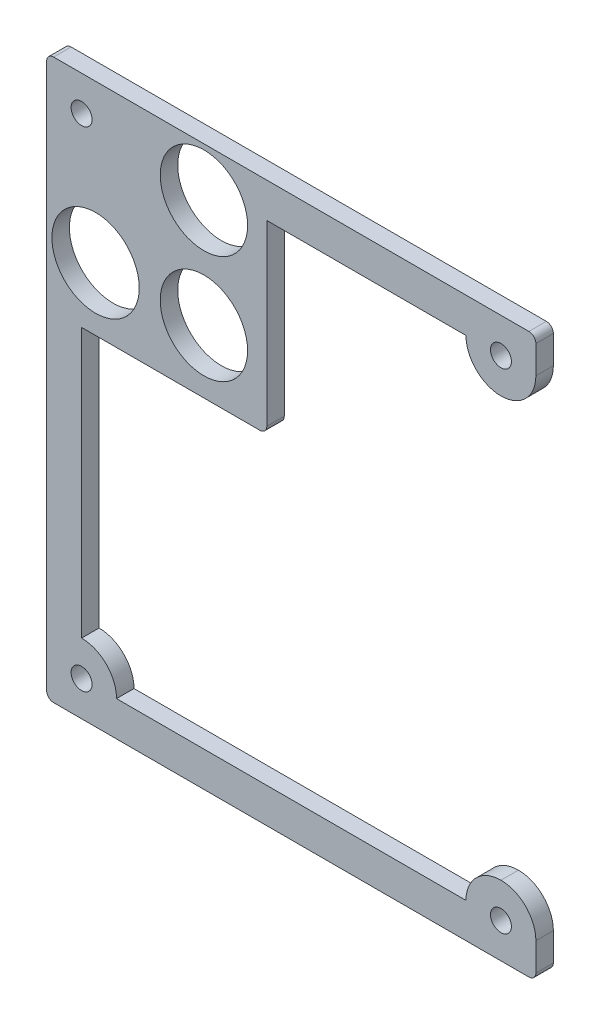
ISO-10303-21;
HEADER;
FILE_DESCRIPTION(('STEP AP214'),'2;1');
FILE_NAME('part.step','',(''),(''),'','','');
FILE_SCHEMA(('AUTOMOTIVE_DESIGN { 1 0 10303 214 1 1 1 1 }'));
ENDSEC;
DATA;
#1=APPLICATION_CONTEXT('core data for automotive mechanical design processes');
#2=APPLICATION_PROTOCOL_DEFINITION('international standard','automotive_design',2000,#1);
#3=PRODUCT_CONTEXT('',#1,'mechanical');
#4=PRODUCT('Part','Part','',(#3));
#5=PRODUCT_RELATED_PRODUCT_CATEGORY('part','',(#4));
#6=PRODUCT_DEFINITION_FORMATION('','',#4);
#7=PRODUCT_DEFINITION_CONTEXT('part definition',#1,'design');
#8=PRODUCT_DEFINITION('design','',#6,#7);
#9=PRODUCT_DEFINITION_SHAPE('','',#8);
#10=(LENGTH_UNIT() NAMED_UNIT(*) SI_UNIT(.MILLI.,.METRE.));
#11=(NAMED_UNIT(*) PLANE_ANGLE_UNIT() SI_UNIT($,.RADIAN.));
#12=(NAMED_UNIT(*) SI_UNIT($,.STERADIAN.) SOLID_ANGLE_UNIT());
#13=UNCERTAINTY_MEASURE_WITH_UNIT(LENGTH_MEASURE(1.E-05),#10,'distance_accuracy_value','');
#14=(GEOMETRIC_REPRESENTATION_CONTEXT(3) GLOBAL_UNCERTAINTY_ASSIGNED_CONTEXT((#13)) GLOBAL_UNIT_ASSIGNED_CONTEXT((#10,
#11,#12)) REPRESENTATION_CONTEXT('',''));
#15=CARTESIAN_POINT('',(0.,0.,0.));
#16=DIRECTION('',(0.,0.,1.));
#17=DIRECTION('',(1.,0.,0.));
#18=AXIS2_PLACEMENT_3D('',#15,#16,#17);
#19=CARTESIAN_POINT('',(130.,150.,5.));
#20=DIRECTION('',(0.,0.,1.));
#21=DIRECTION('',(1.,0.,0.));
#22=AXIS2_PLACEMENT_3D('',#19,#20,#21);
#23=PLANE('',#22);
#24=CARTESIAN_POINT('',(130.,150.,5.));
#25=DIRECTION('',(0.,0.,1.));
#26=DIRECTION('',(1.,0.,0.));
#27=AXIS2_PLACEMENT_3D('',#24,#25,#26);
#28=CIRCLE('',#27,3.);
#29=CARTESIAN_POINT('',(133.,150.,5.));
#30=VERTEX_POINT('',#29);
#31=EDGE_CURVE('E339',#30,#30,#28,.T.);
#32=ORIENTED_EDGE('',*,*,#31,.F.);
#33=EDGE_LOOP('',(#32));
#34=FACE_BOUND('',#33,.T.);
#35=CARTESIAN_POINT('',(10.,10.,5.));
#36=DIRECTION('',(0.,0.,1.));
#37=DIRECTION('',(1.,0.,0.));
#38=AXIS2_PLACEMENT_3D('',#35,#36,#37);
#39=CIRCLE('',#38,2.99999999999999);
#40=CARTESIAN_POINT('',(13.,10.,5.));
#41=VERTEX_POINT('',#40);
#42=EDGE_CURVE('E327',#41,#41,#39,.T.);
#43=ORIENTED_EDGE('',*,*,#42,.F.);
#44=EDGE_LOOP('',(#43));
#45=FACE_BOUND('',#44,.T.);
#46=CARTESIAN_POINT('',(45.,115.,5.));
#47=DIRECTION('',(0.,0.,1.));
#48=DIRECTION('',(1.,0.,0.));
#49=AXIS2_PLACEMENT_3D('',#46,#47,#48);
#50=CIRCLE('',#49,12.5);
#51=CARTESIAN_POINT('',(57.5,115.,5.));
#52=VERTEX_POINT('',#51);
#53=EDGE_CURVE('E315',#52,#52,#50,.T.);
#54=ORIENTED_EDGE('',*,*,#53,.F.);
#55=EDGE_LOOP('',(#54));
#56=FACE_BOUND('',#55,.T.);
#57=CARTESIAN_POINT('',(130.,150.,5.));
#58=DIRECTION('',(0.,0.,1.));
#59=DIRECTION('',(1.,0.,0.));
#60=AXIS2_PLACEMENT_3D('',#57,#58,#59);
#61=CIRCLE('',#60,9.99999999999999);
#62=CARTESIAN_POINT('',(120.,150.,5.));
#63=VERTEX_POINT('',#62);
#64=CARTESIAN_POINT('',(130.,140.,5.));
#65=VERTEX_POINT('',#64);
#66=EDGE_CURVE('E165',#63,#65,#61,.T.);
#67=ORIENTED_EDGE('',*,*,#66,.T.);
#68=CARTESIAN_POINT('',(130.,150.,5.));
#69=DIRECTION('',(0.,0.,1.));
#70=DIRECTION('',(1.,0.,0.));
#71=AXIS2_PLACEMENT_3D('',#68,#69,#70);
#72=CIRCLE('',#71,10.);
#73=CARTESIAN_POINT('',(140.,150.,5.));
#74=VERTEX_POINT('',#73);
#75=EDGE_CURVE('E11',#65,#74,#72,.T.);
#76=ORIENTED_EDGE('',*,*,#75,.T.);
#77=DIRECTION('',(0.,1.,0.));
#78=VECTOR('',#77,1.);
#79=CARTESIAN_POINT('',(140.,140.,5.));
#80=LINE('',#79,#78);
#81=CARTESIAN_POINT('',(140.,158.,5.));
#82=VERTEX_POINT('',#81);
#83=EDGE_CURVE('E173',#74,#82,#80,.T.);
#84=ORIENTED_EDGE('',*,*,#83,.T.);
#85=CARTESIAN_POINT('',(138.,158.,5.));
#86=DIRECTION('',(0.,0.,1.));
#87=DIRECTION('',(1.,0.,0.));
#88=AXIS2_PLACEMENT_3D('',#85,#86,#87);
#89=CIRCLE('',#88,1.99999999999997);
#90=CARTESIAN_POINT('',(138.,160.,5.));
#91=VERTEX_POINT('',#90);
#92=EDGE_CURVE('E309',#82,#91,#89,.T.);
#93=ORIENTED_EDGE('',*,*,#92,.T.);
#94=DIRECTION('',(-1.,0.,0.));
#95=VECTOR('',#94,1.);
#96=CARTESIAN_POINT('',(138.,160.,5.));
#97=LINE('',#96,#95);
#98=CARTESIAN_POINT('',(2.,160.,5.));
#99=VERTEX_POINT('',#98);
#100=EDGE_CURVE('E307',#91,#99,#97,.T.);
#101=ORIENTED_EDGE('',*,*,#100,.T.);
#102=CARTESIAN_POINT('',(2.,158.,5.));
#103=DIRECTION('',(0.,0.,1.));
#104=DIRECTION('',(1.,0.,0.));
#105=AXIS2_PLACEMENT_3D('',#102,#103,#104);
#106=CIRCLE('',#105,2.);
#107=CARTESIAN_POINT('',(0.,158.,5.));
#108=VERTEX_POINT('',#107);
#109=EDGE_CURVE('E305',#99,#108,#106,.T.);
#110=ORIENTED_EDGE('',*,*,#109,.T.);
#111=DIRECTION('',(0.,-1.,0.));
#112=VECTOR('',#111,1.);
#113=CARTESIAN_POINT('',(0.,158.,5.));
#114=LINE('',#113,#112);
#115=CARTESIAN_POINT('',(0.,2.,5.));
#116=VERTEX_POINT('',#115);
#117=EDGE_CURVE('E303',#108,#116,#114,.T.);
#118=ORIENTED_EDGE('',*,*,#117,.T.);
#119=CARTESIAN_POINT('',(2.00000000000001,2.00000000000001,5.));
#120=DIRECTION('',(0.,0.,1.));
#121=DIRECTION('',(1.,0.,0.));
#122=AXIS2_PLACEMENT_3D('',#119,#120,#121);
#123=CIRCLE('',#122,2.00000000000001);
#124=CARTESIAN_POINT('',(2.,0.,5.));
#125=VERTEX_POINT('',#124);
#126=EDGE_CURVE('E301',#116,#125,#123,.T.);
#127=ORIENTED_EDGE('',*,*,#126,.T.);
#128=DIRECTION('',(1.,0.,0.));
#129=VECTOR('',#128,1.);
#130=CARTESIAN_POINT('',(2.,0.,5.));
#131=LINE('',#130,#129);
#132=CARTESIAN_POINT('',(138.,0.,5.));
#133=VERTEX_POINT('',#132);
#134=EDGE_CURVE('E299',#125,#133,#131,.T.);
#135=ORIENTED_EDGE('',*,*,#134,.T.);
#136=CARTESIAN_POINT('',(138.,2.,5.));
#137=DIRECTION('',(0.,0.,1.));
#138=DIRECTION('',(1.,0.,0.));
#139=AXIS2_PLACEMENT_3D('',#136,#137,#138);
#140=CIRCLE('',#139,2.);
#141=CARTESIAN_POINT('',(140.,2.,5.));
#142=VERTEX_POINT('',#141);
#143=EDGE_CURVE('E297',#133,#142,#140,.T.);
#144=ORIENTED_EDGE('',*,*,#143,.T.);
#145=DIRECTION('',(0.,1.,0.));
#146=VECTOR('',#145,1.);
#147=CARTESIAN_POINT('',(140.,20.,5.));
#148=LINE('',#147,#146);
#149=CARTESIAN_POINT('',(140.,10.,5.));
#150=VERTEX_POINT('',#149);
#151=EDGE_CURVE('E294',#142,#150,#148,.T.);
#152=ORIENTED_EDGE('',*,*,#151,.T.);
#153=CARTESIAN_POINT('',(130.,10.,5.));
#154=DIRECTION('',(0.,0.,1.));
#155=DIRECTION('',(1.,0.,0.));
#156=AXIS2_PLACEMENT_3D('',#153,#154,#155);
#157=CIRCLE('',#156,10.);
#158=CARTESIAN_POINT('',(130.,20.,5.));
#159=VERTEX_POINT('',#158);
#160=EDGE_CURVE('E187',#150,#159,#157,.T.);
#161=ORIENTED_EDGE('',*,*,#160,.T.);
#162=CARTESIAN_POINT('',(130.,10.,5.));
#163=DIRECTION('',(0.,0.,1.));
#164=DIRECTION('',(1.,0.,0.));
#165=AXIS2_PLACEMENT_3D('',#162,#163,#164);
#166=CIRCLE('',#165,10.);
#167=CARTESIAN_POINT('',(120.,10.,5.));
#168=VERTEX_POINT('',#167);
#169=EDGE_CURVE('E292',#159,#168,#166,.T.);
#170=ORIENTED_EDGE('',*,*,#169,.T.);
#171=DIRECTION('',(-1.,0.,0.));
#172=VECTOR('',#171,1.);
#173=CARTESIAN_POINT('',(20.,10.,5.));
#174=LINE('',#173,#172);
#175=CARTESIAN_POINT('',(20.,10.,5.));
#176=VERTEX_POINT('',#175);
#177=EDGE_CURVE('E290',#168,#176,#174,.T.);
#178=ORIENTED_EDGE('',*,*,#177,.T.);
#179=CARTESIAN_POINT('',(10.,10.,5.));
#180=DIRECTION('',(0.,0.,1.));
#181=DIRECTION('',(1.,0.,0.));
#182=AXIS2_PLACEMENT_3D('',#179,#180,#181);
#183=CIRCLE('',#182,10.);
#184=CARTESIAN_POINT('',(10.,20.,5.));
#185=VERTEX_POINT('',#184);
#186=EDGE_CURVE('E288',#176,#185,#183,.T.);
#187=ORIENTED_EDGE('',*,*,#186,.T.);
#188=DIRECTION('',(0.,1.,0.));
#189=VECTOR('',#188,1.);
#190=CARTESIAN_POINT('',(10.,97.,5.));
#191=LINE('',#190,#189);
#192=CARTESIAN_POINT('',(10.,97.,5.));
#193=VERTEX_POINT('',#192);
#194=EDGE_CURVE('E286',#185,#193,#191,.T.);
#195=ORIENTED_EDGE('',*,*,#194,.T.);
#196=DIRECTION('',(1.,0.,0.));
#197=VECTOR('',#196,1.);
#198=CARTESIAN_POINT('',(61.,97.,5.));
#199=LINE('',#198,#197);
#200=CARTESIAN_POINT('',(61.,97.,5.));
#201=VERTEX_POINT('',#200);
#202=EDGE_CURVE('E284',#193,#201,#199,.T.);
#203=ORIENTED_EDGE('',*,*,#202,.T.);
#204=CARTESIAN_POINT('',(61.,99.,5.));
#205=DIRECTION('',(0.,0.,1.));
#206=DIRECTION('',(1.,0.,0.));
#207=AXIS2_PLACEMENT_3D('',#204,#205,#206);
#208=CIRCLE('',#207,2.00000000000003);
#209=CARTESIAN_POINT('',(63.,99.,5.));
#210=VERTEX_POINT('',#209);
#211=EDGE_CURVE('E282',#201,#210,#208,.T.);
#212=ORIENTED_EDGE('',*,*,#211,.T.);
#213=DIRECTION('',(0.,1.,0.));
#214=VECTOR('',#213,1.);
#215=CARTESIAN_POINT('',(63.,150.,5.));
#216=LINE('',#215,#214);
#217=CARTESIAN_POINT('',(63.,150.,5.));
#218=VERTEX_POINT('',#217);
#219=EDGE_CURVE('E280',#210,#218,#216,.T.);
#220=ORIENTED_EDGE('',*,*,#219,.T.);
#221=DIRECTION('',(1.,0.,0.));
#222=VECTOR('',#221,1.);
#223=CARTESIAN_POINT('',(120.,150.,5.));
#224=LINE('',#223,#222);
#225=EDGE_CURVE('E169',#218,#63,#224,.T.);
#226=ORIENTED_EDGE('',*,*,#225,.T.);
#227=EDGE_LOOP('',(#67,#76,#84,#93,#101,#110,#118,#127,#135,#144,#152,#161,#170,#178,#187,#195,
#203,#212,#220,#226));
#228=FACE_BOUND('',#227,.T.);
#229=CARTESIAN_POINT('',(14.,115.,5.));
#230=DIRECTION('',(0.,0.,1.));
#231=DIRECTION('',(1.,0.,0.));
#232=AXIS2_PLACEMENT_3D('',#229,#230,#231);
#233=CIRCLE('',#232,12.5);
#234=CARTESIAN_POINT('',(26.5,115.,5.));
#235=VERTEX_POINT('',#234);
#236=EDGE_CURVE('E278',#235,#235,#233,.T.);
#237=ORIENTED_EDGE('',*,*,#236,.F.);
#238=EDGE_LOOP('',(#237));
#239=FACE_BOUND('',#238,.T.);
#240=CARTESIAN_POINT('',(45.,146.,5.));
#241=DIRECTION('',(0.,0.,1.));
#242=DIRECTION('',(1.,0.,0.));
#243=AXIS2_PLACEMENT_3D('',#240,#241,#242);
#244=CIRCLE('',#243,12.5);
#245=CARTESIAN_POINT('',(57.5,146.,5.));
#246=VERTEX_POINT('',#245);
#247=EDGE_CURVE('E321',#246,#246,#244,.T.);
#248=ORIENTED_EDGE('',*,*,#247,.F.);
#249=EDGE_LOOP('',(#248));
#250=FACE_BOUND('',#249,.T.);
#251=CARTESIAN_POINT('',(130.,10.,5.));
#252=DIRECTION('',(0.,0.,1.));
#253=DIRECTION('',(1.,0.,0.));
#254=AXIS2_PLACEMENT_3D('',#251,#252,#253);
#255=CIRCLE('',#254,3.00000000000003);
#256=CARTESIAN_POINT('',(133.,10.,5.));
#257=VERTEX_POINT('',#256);
#258=EDGE_CURVE('E333',#257,#257,#255,.T.);
#259=ORIENTED_EDGE('',*,*,#258,.F.);
#260=EDGE_LOOP('',(#259));
#261=FACE_BOUND('',#260,.T.);
#262=CARTESIAN_POINT('',(10.,150.,5.));
#263=DIRECTION('',(0.,0.,1.));
#264=DIRECTION('',(1.,0.,0.));
#265=AXIS2_PLACEMENT_3D('',#262,#263,#264);
#266=CIRCLE('',#265,2.99999999999997);
#267=CARTESIAN_POINT('',(13.,150.,5.));
#268=VERTEX_POINT('',#267);
#269=EDGE_CURVE('E345',#268,#268,#266,.T.);
#270=ORIENTED_EDGE('',*,*,#269,.F.);
#271=EDGE_LOOP('',(#270));
#272=FACE_BOUND('',#271,.T.);
#273=ADVANCED_FACE('F32',(#34,#45,#56,#228,#239,#250,#261,#272),#23,.T.);
#274=CARTESIAN_POINT('',(130.,150.,0.));
#275=DIRECTION('',(0.,0.,1.));
#276=DIRECTION('',(1.,0.,0.));
#277=AXIS2_PLACEMENT_3D('',#274,#275,#276);
#278=PLANE('',#277);
#279=DIRECTION('',(0.,1.,0.));
#280=VECTOR('',#279,1.);
#281=CARTESIAN_POINT('',(140.,140.,0.));
#282=LINE('',#281,#280);
#283=CARTESIAN_POINT('',(140.,150.,0.));
#284=VERTEX_POINT('',#283);
#285=CARTESIAN_POINT('',(140.,158.,0.));
#286=VERTEX_POINT('',#285);
#287=EDGE_CURVE('E275',#284,#286,#282,.T.);
#288=ORIENTED_EDGE('',*,*,#287,.F.);
#289=CARTESIAN_POINT('',(130.,150.,0.));
#290=DIRECTION('',(0.,0.,1.));
#291=DIRECTION('',(1.,0.,0.));
#292=AXIS2_PLACEMENT_3D('',#289,#290,#291);
#293=CIRCLE('',#292,10.);
#294=CARTESIAN_POINT('',(130.,140.,0.));
#295=VERTEX_POINT('',#294);
#296=EDGE_CURVE('E40',#284,#295,#293,.F.);
#297=ORIENTED_EDGE('',*,*,#296,.T.);
#298=CARTESIAN_POINT('',(130.,150.,0.));
#299=DIRECTION('',(0.,0.,1.));
#300=DIRECTION('',(1.,0.,0.));
#301=AXIS2_PLACEMENT_3D('',#298,#299,#300);
#302=CIRCLE('',#301,9.99999999999999);
#303=CARTESIAN_POINT('',(120.,150.,0.));
#304=VERTEX_POINT('',#303);
#305=EDGE_CURVE('E180',#304,#295,#302,.T.);
#306=ORIENTED_EDGE('',*,*,#305,.F.);
#307=DIRECTION('',(1.,0.,0.));
#308=VECTOR('',#307,1.);
#309=CARTESIAN_POINT('',(120.,150.,0.));
#310=LINE('',#309,#308);
#311=CARTESIAN_POINT('',(63.,150.,0.));
#312=VERTEX_POINT('',#311);
#313=EDGE_CURVE('E174',#312,#304,#310,.T.);
#314=ORIENTED_EDGE('',*,*,#313,.F.);
#315=DIRECTION('',(0.,1.,0.));
#316=VECTOR('',#315,1.);
#317=CARTESIAN_POINT('',(63.,150.,0.));
#318=LINE('',#317,#316);
#319=CARTESIAN_POINT('',(63.,99.,0.));
#320=VERTEX_POINT('',#319);
#321=EDGE_CURVE('E244',#320,#312,#318,.T.);
#322=ORIENTED_EDGE('',*,*,#321,.F.);
#323=CARTESIAN_POINT('',(61.,99.,0.));
#324=DIRECTION('',(0.,0.,1.));
#325=DIRECTION('',(1.,0.,0.));
#326=AXIS2_PLACEMENT_3D('',#323,#324,#325);
#327=CIRCLE('',#326,2.00000000000003);
#328=CARTESIAN_POINT('',(61.,97.,0.));
#329=VERTEX_POINT('',#328);
#330=EDGE_CURVE('E246',#329,#320,#327,.T.);
#331=ORIENTED_EDGE('',*,*,#330,.F.);
#332=DIRECTION('',(1.,0.,0.));
#333=VECTOR('',#332,1.);
#334=CARTESIAN_POINT('',(61.,97.,0.));
#335=LINE('',#334,#333);
#336=CARTESIAN_POINT('',(10.,97.,0.));
#337=VERTEX_POINT('',#336);
#338=EDGE_CURVE('E248',#337,#329,#335,.T.);
#339=ORIENTED_EDGE('',*,*,#338,.F.);
#340=DIRECTION('',(0.,1.,0.));
#341=VECTOR('',#340,1.);
#342=CARTESIAN_POINT('',(10.,97.,0.));
#343=LINE('',#342,#341);
#344=CARTESIAN_POINT('',(10.,20.,0.));
#345=VERTEX_POINT('',#344);
#346=EDGE_CURVE('E250',#345,#337,#343,.T.);
#347=ORIENTED_EDGE('',*,*,#346,.F.);
#348=CARTESIAN_POINT('',(10.,10.,0.));
#349=DIRECTION('',(0.,0.,1.));
#350=DIRECTION('',(1.,0.,0.));
#351=AXIS2_PLACEMENT_3D('',#348,#349,#350);
#352=CIRCLE('',#351,10.);
#353=CARTESIAN_POINT('',(20.,10.,0.));
#354=VERTEX_POINT('',#353);
#355=EDGE_CURVE('E252',#354,#345,#352,.T.);
#356=ORIENTED_EDGE('',*,*,#355,.F.);
#357=DIRECTION('',(-1.,0.,0.));
#358=VECTOR('',#357,1.);
#359=CARTESIAN_POINT('',(20.,10.,0.));
#360=LINE('',#359,#358);
#361=CARTESIAN_POINT('',(120.,10.,0.));
#362=VERTEX_POINT('',#361);
#363=EDGE_CURVE('E254',#362,#354,#360,.T.);
#364=ORIENTED_EDGE('',*,*,#363,.F.);
#365=CARTESIAN_POINT('',(130.,10.,0.));
#366=DIRECTION('',(0.,0.,1.));
#367=DIRECTION('',(1.,0.,0.));
#368=AXIS2_PLACEMENT_3D('',#365,#366,#367);
#369=CIRCLE('',#368,10.);
#370=CARTESIAN_POINT('',(130.,20.,0.));
#371=VERTEX_POINT('',#370);
#372=EDGE_CURVE('E256',#371,#362,#369,.T.);
#373=ORIENTED_EDGE('',*,*,#372,.F.);
#374=CARTESIAN_POINT('',(130.,10.,0.));
#375=DIRECTION('',(0.,0.,1.));
#376=DIRECTION('',(1.,0.,0.));
#377=AXIS2_PLACEMENT_3D('',#374,#375,#376);
#378=CIRCLE('',#377,10.);
#379=CARTESIAN_POINT('',(140.,10.,0.));
#380=VERTEX_POINT('',#379);
#381=EDGE_CURVE('E181',#371,#380,#378,.F.);
#382=ORIENTED_EDGE('',*,*,#381,.T.);
#383=DIRECTION('',(0.,1.,0.));
#384=VECTOR('',#383,1.);
#385=CARTESIAN_POINT('',(140.,20.,0.));
#386=LINE('',#385,#384);
#387=CARTESIAN_POINT('',(140.,2.,0.));
#388=VERTEX_POINT('',#387);
#389=EDGE_CURVE('E258',#388,#380,#386,.T.);
#390=ORIENTED_EDGE('',*,*,#389,.F.);
#391=CARTESIAN_POINT('',(138.,2.,0.));
#392=DIRECTION('',(0.,0.,1.));
#393=DIRECTION('',(1.,0.,0.));
#394=AXIS2_PLACEMENT_3D('',#391,#392,#393);
#395=CIRCLE('',#394,2.);
#396=CARTESIAN_POINT('',(138.,0.,0.));
#397=VERTEX_POINT('',#396);
#398=EDGE_CURVE('E261',#397,#388,#395,.T.);
#399=ORIENTED_EDGE('',*,*,#398,.F.);
#400=DIRECTION('',(1.,0.,0.));
#401=VECTOR('',#400,1.);
#402=CARTESIAN_POINT('',(2.,0.,0.));
#403=LINE('',#402,#401);
#404=CARTESIAN_POINT('',(2.,0.,0.));
#405=VERTEX_POINT('',#404);
#406=EDGE_CURVE('E263',#405,#397,#403,.T.);
#407=ORIENTED_EDGE('',*,*,#406,.F.);
#408=CARTESIAN_POINT('',(2.00000000000001,2.00000000000001,0.));
#409=DIRECTION('',(0.,0.,1.));
#410=DIRECTION('',(1.,0.,0.));
#411=AXIS2_PLACEMENT_3D('',#408,#409,#410);
#412=CIRCLE('',#411,2.00000000000001);
#413=CARTESIAN_POINT('',(0.,2.,0.));
#414=VERTEX_POINT('',#413);
#415=EDGE_CURVE('E265',#414,#405,#412,.T.);
#416=ORIENTED_EDGE('',*,*,#415,.F.);
#417=DIRECTION('',(0.,-1.,0.));
#418=VECTOR('',#417,1.);
#419=CARTESIAN_POINT('',(0.,158.,0.));
#420=LINE('',#419,#418);
#421=CARTESIAN_POINT('',(0.,158.,0.));
#422=VERTEX_POINT('',#421);
#423=EDGE_CURVE('E267',#422,#414,#420,.T.);
#424=ORIENTED_EDGE('',*,*,#423,.F.);
#425=CARTESIAN_POINT('',(2.,158.,0.));
#426=DIRECTION('',(0.,0.,1.));
#427=DIRECTION('',(1.,0.,0.));
#428=AXIS2_PLACEMENT_3D('',#425,#426,#427);
#429=CIRCLE('',#428,2.);
#430=CARTESIAN_POINT('',(2.,160.,0.));
#431=VERTEX_POINT('',#430);
#432=EDGE_CURVE('E269',#431,#422,#429,.T.);
#433=ORIENTED_EDGE('',*,*,#432,.F.);
#434=DIRECTION('',(-1.,0.,0.));
#435=VECTOR('',#434,1.);
#436=CARTESIAN_POINT('',(138.,160.,0.));
#437=LINE('',#436,#435);
#438=CARTESIAN_POINT('',(138.,160.,0.));
#439=VERTEX_POINT('',#438);
#440=EDGE_CURVE('E271',#439,#431,#437,.T.);
#441=ORIENTED_EDGE('',*,*,#440,.F.);
#442=CARTESIAN_POINT('',(138.,158.,0.));
#443=DIRECTION('',(0.,0.,1.));
#444=DIRECTION('',(1.,0.,0.));
#445=AXIS2_PLACEMENT_3D('',#442,#443,#444);
#446=CIRCLE('',#445,1.99999999999997);
#447=EDGE_CURVE('E273',#286,#439,#446,.T.);
#448=ORIENTED_EDGE('',*,*,#447,.F.);
#449=EDGE_LOOP('',(#288,#297,#306,#314,#322,#331,#339,#347,#356,#364,#373,#382,#390,#399,#407,
#416,#424,#433,#441,#448));
#450=FACE_BOUND('',#449,.T.);
#451=CARTESIAN_POINT('',(14.,115.,0.));
#452=DIRECTION('',(0.,0.,1.));
#453=DIRECTION('',(1.,0.,0.));
#454=AXIS2_PLACEMENT_3D('',#451,#452,#453);
#455=CIRCLE('',#454,12.5);
#456=CARTESIAN_POINT('',(26.5,115.,0.));
#457=VERTEX_POINT('',#456);
#458=EDGE_CURVE('E312',#457,#457,#455,.T.);
#459=ORIENTED_EDGE('',*,*,#458,.T.);
#460=EDGE_LOOP('',(#459));
#461=FACE_BOUND('',#460,.T.);
#462=CARTESIAN_POINT('',(45.,115.,0.));
#463=DIRECTION('',(0.,0.,1.));
#464=DIRECTION('',(1.,0.,0.));
#465=AXIS2_PLACEMENT_3D('',#462,#463,#464);
#466=CIRCLE('',#465,12.5);
#467=CARTESIAN_POINT('',(57.5,115.,0.));
#468=VERTEX_POINT('',#467);
#469=EDGE_CURVE('E318',#468,#468,#466,.T.);
#470=ORIENTED_EDGE('',*,*,#469,.T.);
#471=EDGE_LOOP('',(#470));
#472=FACE_BOUND('',#471,.T.);
#473=CARTESIAN_POINT('',(45.,146.,0.));
#474=DIRECTION('',(0.,0.,1.));
#475=DIRECTION('',(1.,0.,0.));
#476=AXIS2_PLACEMENT_3D('',#473,#474,#475);
#477=CIRCLE('',#476,12.5);
#478=CARTESIAN_POINT('',(57.5,146.,0.));
#479=VERTEX_POINT('',#478);
#480=EDGE_CURVE('E324',#479,#479,#477,.T.);
#481=ORIENTED_EDGE('',*,*,#480,.T.);
#482=EDGE_LOOP('',(#481));
#483=FACE_BOUND('',#482,.T.);
#484=CARTESIAN_POINT('',(10.,10.,0.));
#485=DIRECTION('',(0.,0.,1.));
#486=DIRECTION('',(1.,0.,0.));
#487=AXIS2_PLACEMENT_3D('',#484,#485,#486);
#488=CIRCLE('',#487,2.99999999999999);
#489=CARTESIAN_POINT('',(13.,10.,0.));
#490=VERTEX_POINT('',#489);
#491=EDGE_CURVE('E330',#490,#490,#488,.T.);
#492=ORIENTED_EDGE('',*,*,#491,.T.);
#493=EDGE_LOOP('',(#492));
#494=FACE_BOUND('',#493,.T.);
#495=CARTESIAN_POINT('',(130.,10.,0.));
#496=DIRECTION('',(0.,0.,1.));
#497=DIRECTION('',(1.,0.,0.));
#498=AXIS2_PLACEMENT_3D('',#495,#496,#497);
#499=CIRCLE('',#498,3.00000000000003);
#500=CARTESIAN_POINT('',(133.,10.,0.));
#501=VERTEX_POINT('',#500);
#502=EDGE_CURVE('E336',#501,#501,#499,.T.);
#503=ORIENTED_EDGE('',*,*,#502,.T.);
#504=EDGE_LOOP('',(#503));
#505=FACE_BOUND('',#504,.T.);
#506=CARTESIAN_POINT('',(130.,150.,0.));
#507=DIRECTION('',(0.,0.,1.));
#508=DIRECTION('',(1.,0.,0.));
#509=AXIS2_PLACEMENT_3D('',#506,#507,#508);
#510=CIRCLE('',#509,3.);
#511=CARTESIAN_POINT('',(133.,150.,0.));
#512=VERTEX_POINT('',#511);
#513=EDGE_CURVE('E342',#512,#512,#510,.T.);
#514=ORIENTED_EDGE('',*,*,#513,.T.);
#515=EDGE_LOOP('',(#514));
#516=FACE_BOUND('',#515,.T.);
#517=CARTESIAN_POINT('',(10.,150.,0.));
#518=DIRECTION('',(0.,0.,1.));
#519=DIRECTION('',(1.,0.,0.));
#520=AXIS2_PLACEMENT_3D('',#517,#518,#519);
#521=CIRCLE('',#520,2.99999999999997);
#522=CARTESIAN_POINT('',(13.,150.,0.));
#523=VERTEX_POINT('',#522);
#524=EDGE_CURVE('E348',#523,#523,#521,.T.);
#525=ORIENTED_EDGE('',*,*,#524,.T.);
#526=EDGE_LOOP('',(#525));
#527=FACE_BOUND('',#526,.T.);
#528=ADVANCED_FACE('F358',(#450,#461,#472,#483,#494,#505,#516,#527),#278,.F.);
#529=CARTESIAN_POINT('',(130.,150.,5.));
#530=DIRECTION('',(0.,0.,-1.));
#531=DIRECTION('',(-1.,0.,0.));
#532=AXIS2_PLACEMENT_3D('',#529,#530,#531);
#533=CYLINDRICAL_SURFACE('',#532,9.99999999999999);
#534=ORIENTED_EDGE('',*,*,#305,.T.);
#535=DIRECTION('',(0.,0.,-1.));
#536=VECTOR('',#535,1.);
#537=CARTESIAN_POINT('',(130.,140.,5.));
#538=LINE('',#537,#536);
#539=EDGE_CURVE('E177',#65,#295,#538,.T.);
#540=ORIENTED_EDGE('',*,*,#539,.F.);
#541=ORIENTED_EDGE('',*,*,#66,.F.);
#542=DIRECTION('',(0.,0.,-1.));
#543=VECTOR('',#542,1.);
#544=CARTESIAN_POINT('',(120.,150.,5.));
#545=LINE('',#544,#543);
#546=EDGE_CURVE('E241',#63,#304,#545,.T.);
#547=ORIENTED_EDGE('',*,*,#546,.T.);
#548=EDGE_LOOP('',(#534,#540,#541,#547));
#549=FACE_BOUND('',#548,.T.);
#550=ADVANCED_FACE('F178',(#549),#533,.T.);
#551=CARTESIAN_POINT('',(140.,140.,5.));
#552=DIRECTION('',(-1.,0.,0.));
#553=DIRECTION('',(0.,0.,1.));
#554=AXIS2_PLACEMENT_3D('',#551,#552,#553);
#555=PLANE('',#554);
#556=ORIENTED_EDGE('',*,*,#83,.F.);
#557=DIRECTION('',(0.,0.,-1.));
#558=VECTOR('',#557,1.);
#559=CARTESIAN_POINT('',(140.,150.,5.));
#560=LINE('',#559,#558);
#561=EDGE_CURVE('E184',#74,#284,#560,.T.);
#562=ORIENTED_EDGE('',*,*,#561,.T.);
#563=ORIENTED_EDGE('',*,*,#287,.T.);
#564=DIRECTION('',(0.,0.,-1.));
#565=VECTOR('',#564,1.);
#566=CARTESIAN_POINT('',(140.,158.,5.));
#567=LINE('',#566,#565);
#568=EDGE_CURVE('E182',#82,#286,#567,.T.);
#569=ORIENTED_EDGE('',*,*,#568,.F.);
#570=EDGE_LOOP('',(#556,#562,#563,#569));
#571=FACE_BOUND('',#570,.T.);
#572=ADVANCED_FACE('F435',(#571),#555,.F.);
#573=CARTESIAN_POINT('',(138.,158.,5.));
#574=DIRECTION('',(0.,0.,-1.));
#575=DIRECTION('',(-1.,0.,0.));
#576=AXIS2_PLACEMENT_3D('',#573,#574,#575);
#577=CYLINDRICAL_SURFACE('',#576,1.99999999999997);
#578=ORIENTED_EDGE('',*,*,#447,.T.);
#579=DIRECTION('',(0.,0.,-1.));
#580=VECTOR('',#579,1.);
#581=CARTESIAN_POINT('',(138.,160.,5.));
#582=LINE('',#581,#580);
#583=EDGE_CURVE('E196',#91,#439,#582,.T.);
#584=ORIENTED_EDGE('',*,*,#583,.F.);
#585=ORIENTED_EDGE('',*,*,#92,.F.);
#586=ORIENTED_EDGE('',*,*,#568,.T.);
#587=EDGE_LOOP('',(#578,#584,#585,#586));
#588=FACE_BOUND('',#587,.T.);
#589=ADVANCED_FACE('F431',(#588),#577,.T.);
#590=CARTESIAN_POINT('',(138.,160.,5.));
#591=DIRECTION('',(0.,-1.,0.));
#592=DIRECTION('',(0.,0.,-1.));
#593=AXIS2_PLACEMENT_3D('',#590,#591,#592);
#594=PLANE('',#593);
#595=ORIENTED_EDGE('',*,*,#440,.T.);
#596=DIRECTION('',(0.,0.,-1.));
#597=VECTOR('',#596,1.);
#598=CARTESIAN_POINT('',(2.,160.,5.));
#599=LINE('',#598,#597);
#600=EDGE_CURVE('E199',#99,#431,#599,.T.);
#601=ORIENTED_EDGE('',*,*,#600,.F.);
#602=ORIENTED_EDGE('',*,*,#100,.F.);
#603=ORIENTED_EDGE('',*,*,#583,.T.);
#604=EDGE_LOOP('',(#595,#601,#602,#603));
#605=FACE_BOUND('',#604,.T.);
#606=ADVANCED_FACE('F427',(#605),#594,.F.);
#607=CARTESIAN_POINT('',(2.,158.,5.));
#608=DIRECTION('',(0.,0.,-1.));
#609=DIRECTION('',(-1.,0.,0.));
#610=AXIS2_PLACEMENT_3D('',#607,#608,#609);
#611=CYLINDRICAL_SURFACE('',#610,2.);
#612=ORIENTED_EDGE('',*,*,#432,.T.);
#613=DIRECTION('',(0.,0.,-1.));
#614=VECTOR('',#613,1.);
#615=CARTESIAN_POINT('',(0.,158.,5.));
#616=LINE('',#615,#614);
#617=EDGE_CURVE('E202',#108,#422,#616,.T.);
#618=ORIENTED_EDGE('',*,*,#617,.F.);
#619=ORIENTED_EDGE('',*,*,#109,.F.);
#620=ORIENTED_EDGE('',*,*,#600,.T.);
#621=EDGE_LOOP('',(#612,#618,#619,#620));
#622=FACE_BOUND('',#621,.T.);
#623=ADVANCED_FACE('F423',(#622),#611,.T.);
#624=CARTESIAN_POINT('',(0.,158.,5.));
#625=DIRECTION('',(1.,0.,0.));
#626=DIRECTION('',(0.,0.,-1.));
#627=AXIS2_PLACEMENT_3D('',#624,#625,#626);
#628=PLANE('',#627);
#629=ORIENTED_EDGE('',*,*,#423,.T.);
#630=DIRECTION('',(0.,0.,-1.));
#631=VECTOR('',#630,1.);
#632=CARTESIAN_POINT('',(0.,2.,5.));
#633=LINE('',#632,#631);
#634=EDGE_CURVE('E205',#116,#414,#633,.T.);
#635=ORIENTED_EDGE('',*,*,#634,.F.);
#636=ORIENTED_EDGE('',*,*,#117,.F.);
#637=ORIENTED_EDGE('',*,*,#617,.T.);
#638=EDGE_LOOP('',(#629,#635,#636,#637));
#639=FACE_BOUND('',#638,.T.);
#640=ADVANCED_FACE('F419',(#639),#628,.F.);
#641=CARTESIAN_POINT('',(2.00000000000001,2.00000000000001,5.));
#642=DIRECTION('',(0.,0.,-1.));
#643=DIRECTION('',(-1.,0.,0.));
#644=AXIS2_PLACEMENT_3D('',#641,#642,#643);
#645=CYLINDRICAL_SURFACE('',#644,2.00000000000001);
#646=ORIENTED_EDGE('',*,*,#415,.T.);
#647=DIRECTION('',(0.,0.,-1.));
#648=VECTOR('',#647,1.);
#649=CARTESIAN_POINT('',(2.,0.,5.));
#650=LINE('',#649,#648);
#651=EDGE_CURVE('E208',#125,#405,#650,.T.);
#652=ORIENTED_EDGE('',*,*,#651,.F.);
#653=ORIENTED_EDGE('',*,*,#126,.F.);
#654=ORIENTED_EDGE('',*,*,#634,.T.);
#655=EDGE_LOOP('',(#646,#652,#653,#654));
#656=FACE_BOUND('',#655,.T.);
#657=ADVANCED_FACE('F415',(#656),#645,.T.);
#658=CARTESIAN_POINT('',(2.,0.,5.));
#659=DIRECTION('',(0.,1.,0.));
#660=DIRECTION('',(0.,0.,1.));
#661=AXIS2_PLACEMENT_3D('',#658,#659,#660);
#662=PLANE('',#661);
#663=ORIENTED_EDGE('',*,*,#406,.T.);
#664=DIRECTION('',(0.,0.,-1.));
#665=VECTOR('',#664,1.);
#666=CARTESIAN_POINT('',(138.,0.,5.));
#667=LINE('',#666,#665);
#668=EDGE_CURVE('E211',#133,#397,#667,.T.);
#669=ORIENTED_EDGE('',*,*,#668,.F.);
#670=ORIENTED_EDGE('',*,*,#134,.F.);
#671=ORIENTED_EDGE('',*,*,#651,.T.);
#672=EDGE_LOOP('',(#663,#669,#670,#671));
#673=FACE_BOUND('',#672,.T.);
#674=ADVANCED_FACE('F411',(#673),#662,.F.);
#675=CARTESIAN_POINT('',(138.,2.,5.));
#676=DIRECTION('',(0.,0.,-1.));
#677=DIRECTION('',(-1.,0.,0.));
#678=AXIS2_PLACEMENT_3D('',#675,#676,#677);
#679=CYLINDRICAL_SURFACE('',#678,2.);
#680=ORIENTED_EDGE('',*,*,#398,.T.);
#681=DIRECTION('',(0.,0.,-1.));
#682=VECTOR('',#681,1.);
#683=CARTESIAN_POINT('',(140.,2.,5.));
#684=LINE('',#683,#682);
#685=EDGE_CURVE('E214',#142,#388,#684,.T.);
#686=ORIENTED_EDGE('',*,*,#685,.F.);
#687=ORIENTED_EDGE('',*,*,#143,.F.);
#688=ORIENTED_EDGE('',*,*,#668,.T.);
#689=EDGE_LOOP('',(#680,#686,#687,#688));
#690=FACE_BOUND('',#689,.T.);
#691=ADVANCED_FACE('F407',(#690),#679,.T.);
#692=CARTESIAN_POINT('',(140.,20.,5.));
#693=DIRECTION('',(-1.,0.,0.));
#694=DIRECTION('',(0.,0.,1.));
#695=AXIS2_PLACEMENT_3D('',#692,#693,#694);
#696=PLANE('',#695);
#697=ORIENTED_EDGE('',*,*,#389,.T.);
#698=DIRECTION('',(0.,0.,-1.));
#699=VECTOR('',#698,1.);
#700=CARTESIAN_POINT('',(140.,10.,5.));
#701=LINE('',#700,#699);
#702=EDGE_CURVE('E189',#380,#150,#701,.F.);
#703=ORIENTED_EDGE('',*,*,#702,.T.);
#704=ORIENTED_EDGE('',*,*,#151,.F.);
#705=ORIENTED_EDGE('',*,*,#685,.T.);
#706=EDGE_LOOP('',(#697,#703,#704,#705));
#707=FACE_BOUND('',#706,.T.);
#708=ADVANCED_FACE('F403',(#707),#696,.F.);
#709=CARTESIAN_POINT('',(130.,10.,5.));
#710=DIRECTION('',(0.,0.,-1.));
#711=DIRECTION('',(-1.,0.,0.));
#712=AXIS2_PLACEMENT_3D('',#709,#710,#711);
#713=CYLINDRICAL_SURFACE('',#712,10.);
#714=ORIENTED_EDGE('',*,*,#372,.T.);
#715=DIRECTION('',(0.,0.,-1.));
#716=VECTOR('',#715,1.);
#717=CARTESIAN_POINT('',(120.,10.,5.));
#718=LINE('',#717,#716);
#719=EDGE_CURVE('E220',#168,#362,#718,.T.);
#720=ORIENTED_EDGE('',*,*,#719,.F.);
#721=ORIENTED_EDGE('',*,*,#169,.F.);
#722=DIRECTION('',(0.,0.,-1.));
#723=VECTOR('',#722,1.);
#724=CARTESIAN_POINT('',(130.,20.,5.));
#725=LINE('',#724,#723);
#726=EDGE_CURVE('E217',#159,#371,#725,.T.);
#727=ORIENTED_EDGE('',*,*,#726,.T.);
#728=EDGE_LOOP('',(#714,#720,#721,#727));
#729=FACE_BOUND('',#728,.T.);
#730=ADVANCED_FACE('F399',(#729),#713,.T.);
#731=CARTESIAN_POINT('',(20.,10.,5.));
#732=DIRECTION('',(0.,-1.,0.));
#733=DIRECTION('',(0.,0.,-1.));
#734=AXIS2_PLACEMENT_3D('',#731,#732,#733);
#735=PLANE('',#734);
#736=ORIENTED_EDGE('',*,*,#363,.T.);
#737=DIRECTION('',(0.,0.,-1.));
#738=VECTOR('',#737,1.);
#739=CARTESIAN_POINT('',(20.,10.,5.));
#740=LINE('',#739,#738);
#741=EDGE_CURVE('E223',#176,#354,#740,.T.);
#742=ORIENTED_EDGE('',*,*,#741,.F.);
#743=ORIENTED_EDGE('',*,*,#177,.F.);
#744=ORIENTED_EDGE('',*,*,#719,.T.);
#745=EDGE_LOOP('',(#736,#742,#743,#744));
#746=FACE_BOUND('',#745,.T.);
#747=ADVANCED_FACE('F395',(#746),#735,.F.);
#748=CARTESIAN_POINT('',(10.,10.,5.));
#749=DIRECTION('',(0.,0.,-1.));
#750=DIRECTION('',(-1.,0.,0.));
#751=AXIS2_PLACEMENT_3D('',#748,#749,#750);
#752=CYLINDRICAL_SURFACE('',#751,10.);
#753=ORIENTED_EDGE('',*,*,#355,.T.);
#754=DIRECTION('',(0.,0.,-1.));
#755=VECTOR('',#754,1.);
#756=CARTESIAN_POINT('',(10.,20.,5.));
#757=LINE('',#756,#755);
#758=EDGE_CURVE('E226',#185,#345,#757,.T.);
#759=ORIENTED_EDGE('',*,*,#758,.F.);
#760=ORIENTED_EDGE('',*,*,#186,.F.);
#761=ORIENTED_EDGE('',*,*,#741,.T.);
#762=EDGE_LOOP('',(#753,#759,#760,#761));
#763=FACE_BOUND('',#762,.T.);
#764=ADVANCED_FACE('F391',(#763),#752,.T.);
#765=CARTESIAN_POINT('',(10.,97.,5.));
#766=DIRECTION('',(-1.,0.,0.));
#767=DIRECTION('',(0.,0.,1.));
#768=AXIS2_PLACEMENT_3D('',#765,#766,#767);
#769=PLANE('',#768);
#770=ORIENTED_EDGE('',*,*,#346,.T.);
#771=DIRECTION('',(0.,0.,-1.));
#772=VECTOR('',#771,1.);
#773=CARTESIAN_POINT('',(10.,97.,5.));
#774=LINE('',#773,#772);
#775=EDGE_CURVE('E229',#193,#337,#774,.T.);
#776=ORIENTED_EDGE('',*,*,#775,.F.);
#777=ORIENTED_EDGE('',*,*,#194,.F.);
#778=ORIENTED_EDGE('',*,*,#758,.T.);
#779=EDGE_LOOP('',(#770,#776,#777,#778));
#780=FACE_BOUND('',#779,.T.);
#781=ADVANCED_FACE('F387',(#780),#769,.F.);
#782=CARTESIAN_POINT('',(61.,97.,5.));
#783=DIRECTION('',(0.,1.,0.));
#784=DIRECTION('',(0.,0.,1.));
#785=AXIS2_PLACEMENT_3D('',#782,#783,#784);
#786=PLANE('',#785);
#787=ORIENTED_EDGE('',*,*,#338,.T.);
#788=DIRECTION('',(0.,0.,-1.));
#789=VECTOR('',#788,1.);
#790=CARTESIAN_POINT('',(61.,97.,5.));
#791=LINE('',#790,#789);
#792=EDGE_CURVE('E232',#201,#329,#791,.T.);
#793=ORIENTED_EDGE('',*,*,#792,.F.);
#794=ORIENTED_EDGE('',*,*,#202,.F.);
#795=ORIENTED_EDGE('',*,*,#775,.T.);
#796=EDGE_LOOP('',(#787,#793,#794,#795));
#797=FACE_BOUND('',#796,.T.);
#798=ADVANCED_FACE('F383',(#797),#786,.F.);
#799=CARTESIAN_POINT('',(61.,99.,5.));
#800=DIRECTION('',(0.,0.,-1.));
#801=DIRECTION('',(-1.,0.,0.));
#802=AXIS2_PLACEMENT_3D('',#799,#800,#801);
#803=CYLINDRICAL_SURFACE('',#802,2.00000000000003);
#804=ORIENTED_EDGE('',*,*,#330,.T.);
#805=DIRECTION('',(0.,0.,-1.));
#806=VECTOR('',#805,1.);
#807=CARTESIAN_POINT('',(63.,99.,5.));
#808=LINE('',#807,#806);
#809=EDGE_CURVE('E235',#210,#320,#808,.T.);
#810=ORIENTED_EDGE('',*,*,#809,.F.);
#811=ORIENTED_EDGE('',*,*,#211,.F.);
#812=ORIENTED_EDGE('',*,*,#792,.T.);
#813=EDGE_LOOP('',(#804,#810,#811,#812));
#814=FACE_BOUND('',#813,.T.);
#815=ADVANCED_FACE('F379',(#814),#803,.T.);
#816=CARTESIAN_POINT('',(63.,150.,5.));
#817=DIRECTION('',(-1.,0.,0.));
#818=DIRECTION('',(0.,0.,1.));
#819=AXIS2_PLACEMENT_3D('',#816,#817,#818);
#820=PLANE('',#819);
#821=ORIENTED_EDGE('',*,*,#321,.T.);
#822=DIRECTION('',(0.,0.,-1.));
#823=VECTOR('',#822,1.);
#824=CARTESIAN_POINT('',(63.,150.,5.));
#825=LINE('',#824,#823);
#826=EDGE_CURVE('E238',#218,#312,#825,.T.);
#827=ORIENTED_EDGE('',*,*,#826,.F.);
#828=ORIENTED_EDGE('',*,*,#219,.F.);
#829=ORIENTED_EDGE('',*,*,#809,.T.);
#830=EDGE_LOOP('',(#821,#827,#828,#829));
#831=FACE_BOUND('',#830,.T.);
#832=ADVANCED_FACE('F375',(#831),#820,.F.);
#833=CARTESIAN_POINT('',(120.,150.,5.));
#834=DIRECTION('',(0.,1.,0.));
#835=DIRECTION('',(0.,0.,1.));
#836=AXIS2_PLACEMENT_3D('',#833,#834,#835);
#837=PLANE('',#836);
#838=ORIENTED_EDGE('',*,*,#313,.T.);
#839=ORIENTED_EDGE('',*,*,#546,.F.);
#840=ORIENTED_EDGE('',*,*,#225,.F.);
#841=ORIENTED_EDGE('',*,*,#826,.T.);
#842=EDGE_LOOP('',(#838,#839,#840,#841));
#843=FACE_BOUND('',#842,.T.);
#844=ADVANCED_FACE('F372',(#843),#837,.F.);
#845=CARTESIAN_POINT('',(14.,115.,5.));
#846=DIRECTION('',(0.,0.,-1.));
#847=DIRECTION('',(-1.,0.,0.));
#848=AXIS2_PLACEMENT_3D('',#845,#846,#847);
#849=CYLINDRICAL_SURFACE('',#848,12.5);
#850=ORIENTED_EDGE('',*,*,#236,.T.);
#851=EDGE_LOOP('',(#850));
#852=FACE_BOUND('',#851,.T.);
#853=ORIENTED_EDGE('',*,*,#458,.F.);
#854=EDGE_LOOP('',(#853));
#855=FACE_BOUND('',#854,.T.);
#856=ADVANCED_FACE('F369',(#852,#855),#849,.F.);
#857=CARTESIAN_POINT('',(45.,115.,5.));
#858=DIRECTION('',(0.,0.,-1.));
#859=DIRECTION('',(-1.,0.,0.));
#860=AXIS2_PLACEMENT_3D('',#857,#858,#859);
#861=CYLINDRICAL_SURFACE('',#860,12.5);
#862=ORIENTED_EDGE('',*,*,#53,.T.);
#863=EDGE_LOOP('',(#862));
#864=FACE_BOUND('',#863,.T.);
#865=ORIENTED_EDGE('',*,*,#469,.F.);
#866=EDGE_LOOP('',(#865));
#867=FACE_BOUND('',#866,.T.);
#868=ADVANCED_FACE('F529',(#864,#867),#861,.F.);
#869=CARTESIAN_POINT('',(45.,146.,5.));
#870=DIRECTION('',(0.,0.,-1.));
#871=DIRECTION('',(-1.,0.,0.));
#872=AXIS2_PLACEMENT_3D('',#869,#870,#871);
#873=CYLINDRICAL_SURFACE('',#872,12.5);
#874=ORIENTED_EDGE('',*,*,#247,.T.);
#875=EDGE_LOOP('',(#874));
#876=FACE_BOUND('',#875,.T.);
#877=ORIENTED_EDGE('',*,*,#480,.F.);
#878=EDGE_LOOP('',(#877));
#879=FACE_BOUND('',#878,.T.);
#880=ADVANCED_FACE('F526',(#876,#879),#873,.F.);
#881=CARTESIAN_POINT('',(10.,10.,5.));
#882=DIRECTION('',(0.,0.,-1.));
#883=DIRECTION('',(-1.,0.,0.));
#884=AXIS2_PLACEMENT_3D('',#881,#882,#883);
#885=CYLINDRICAL_SURFACE('',#884,2.99999999999999);
#886=ORIENTED_EDGE('',*,*,#42,.T.);
#887=EDGE_LOOP('',(#886));
#888=FACE_BOUND('',#887,.T.);
#889=ORIENTED_EDGE('',*,*,#491,.F.);
#890=EDGE_LOOP('',(#889));
#891=FACE_BOUND('',#890,.T.);
#892=ADVANCED_FACE('F520',(#888,#891),#885,.F.);
#893=CARTESIAN_POINT('',(130.,10.,5.));
#894=DIRECTION('',(0.,0.,-1.));
#895=DIRECTION('',(-1.,0.,0.));
#896=AXIS2_PLACEMENT_3D('',#893,#894,#895);
#897=CYLINDRICAL_SURFACE('',#896,3.00000000000003);
#898=ORIENTED_EDGE('',*,*,#258,.T.);
#899=EDGE_LOOP('',(#898));
#900=FACE_BOUND('',#899,.T.);
#901=ORIENTED_EDGE('',*,*,#502,.F.);
#902=EDGE_LOOP('',(#901));
#903=FACE_BOUND('',#902,.T.);
#904=ADVANCED_FACE('F514',(#900,#903),#897,.F.);
#905=CARTESIAN_POINT('',(130.,150.,5.));
#906=DIRECTION('',(0.,0.,-1.));
#907=DIRECTION('',(-1.,0.,0.));
#908=AXIS2_PLACEMENT_3D('',#905,#906,#907);
#909=CYLINDRICAL_SURFACE('',#908,3.);
#910=ORIENTED_EDGE('',*,*,#31,.T.);
#911=EDGE_LOOP('',(#910));
#912=FACE_BOUND('',#911,.T.);
#913=ORIENTED_EDGE('',*,*,#513,.F.);
#914=EDGE_LOOP('',(#913));
#915=FACE_BOUND('',#914,.T.);
#916=ADVANCED_FACE('F447',(#912,#915),#909,.F.);
#917=CARTESIAN_POINT('',(10.,150.,5.));
#918=DIRECTION('',(0.,0.,-1.));
#919=DIRECTION('',(-1.,0.,0.));
#920=AXIS2_PLACEMENT_3D('',#917,#918,#919);
#921=CYLINDRICAL_SURFACE('',#920,2.99999999999997);
#922=ORIENTED_EDGE('',*,*,#269,.T.);
#923=EDGE_LOOP('',(#922));
#924=FACE_BOUND('',#923,.T.);
#925=ORIENTED_EDGE('',*,*,#524,.F.);
#926=EDGE_LOOP('',(#925));
#927=FACE_BOUND('',#926,.T.);
#928=ADVANCED_FACE('F354',(#924,#927),#921,.F.);
#929=CARTESIAN_POINT('',(130.,10.,5.));
#930=DIRECTION('',(0.,0.,-1.));
#931=DIRECTION('',(-1.,0.,0.));
#932=AXIS2_PLACEMENT_3D('',#929,#930,#931);
#933=CYLINDRICAL_SURFACE('',#932,10.);
#934=ORIENTED_EDGE('',*,*,#160,.F.);
#935=ORIENTED_EDGE('',*,*,#702,.F.);
#936=ORIENTED_EDGE('',*,*,#381,.F.);
#937=ORIENTED_EDGE('',*,*,#726,.F.);
#938=EDGE_LOOP('',(#934,#935,#936,#937));
#939=FACE_BOUND('',#938,.T.);
#940=ADVANCED_FACE('F440',(#939),#933,.T.);
#941=CARTESIAN_POINT('',(130.,150.,5.));
#942=DIRECTION('',(0.,0.,-1.));
#943=DIRECTION('',(-1.,0.,0.));
#944=AXIS2_PLACEMENT_3D('',#941,#942,#943);
#945=CYLINDRICAL_SURFACE('',#944,10.);
#946=ORIENTED_EDGE('',*,*,#75,.F.);
#947=ORIENTED_EDGE('',*,*,#539,.T.);
#948=ORIENTED_EDGE('',*,*,#296,.F.);
#949=ORIENTED_EDGE('',*,*,#561,.F.);
#950=EDGE_LOOP('',(#946,#947,#948,#949));
#951=FACE_BOUND('',#950,.T.);
#952=ADVANCED_FACE('F34',(#951),#945,.T.);
#953=CLOSED_SHELL('',(#273,#528,#550,#572,#589,#606,#623,#640,#657,#674,#691,#708,#730,#747,
#764,#781,#798,#815,#832,#844,#856,#868,#880,#892,#904,#916,#928,#940,#952));
#954=MANIFOLD_SOLID_BREP('B2',#953);
#955=ADVANCED_BREP_SHAPE_REPRESENTATION('',(#18,#954),#14);
#956=SHAPE_DEFINITION_REPRESENTATION(#9,#955);
ENDSEC;
END-ISO-10303-21;
